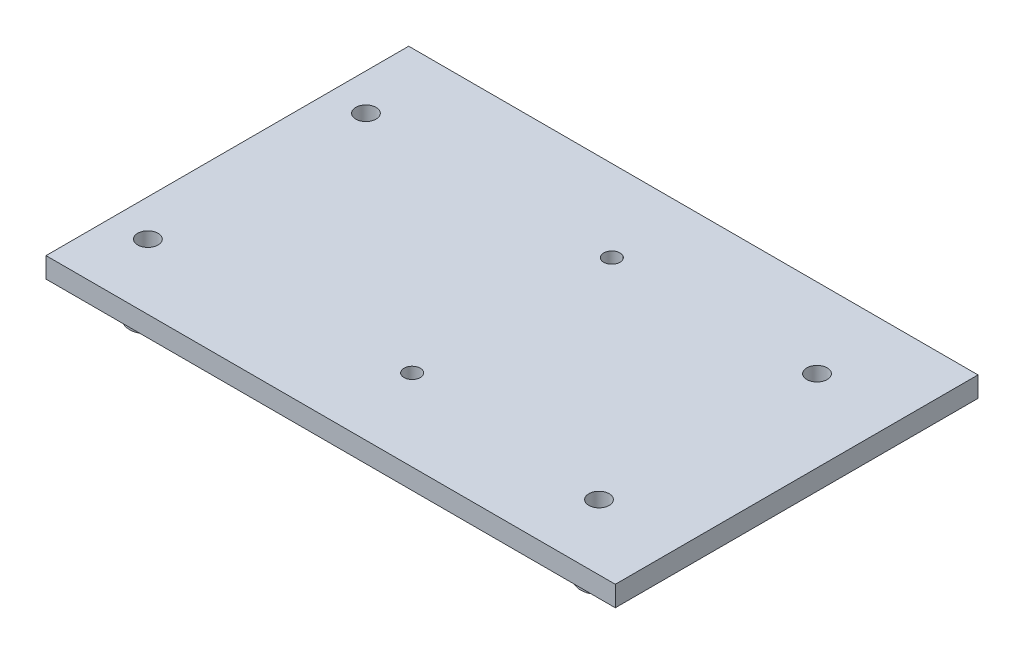
ISO-10303-21;
HEADER;
FILE_DESCRIPTION(('STEP AP214'),'2;1');
FILE_NAME('part.step','',(''),(''),'','','');
FILE_SCHEMA(('AUTOMOTIVE_DESIGN { 1 0 10303 214 1 1 1 1 }'));
ENDSEC;
DATA;
#1=APPLICATION_CONTEXT('core data for automotive mechanical design processes');
#2=APPLICATION_PROTOCOL_DEFINITION('international standard','automotive_design',2000,#1);
#3=PRODUCT_CONTEXT('',#1,'mechanical');
#4=PRODUCT('Part','Part','',(#3));
#5=PRODUCT_RELATED_PRODUCT_CATEGORY('part','',(#4));
#6=PRODUCT_DEFINITION_FORMATION('','',#4);
#7=PRODUCT_DEFINITION_CONTEXT('part definition',#1,'design');
#8=PRODUCT_DEFINITION('design','',#6,#7);
#9=PRODUCT_DEFINITION_SHAPE('','',#8);
#10=(LENGTH_UNIT() NAMED_UNIT(*) SI_UNIT(.MILLI.,.METRE.));
#11=(NAMED_UNIT(*) PLANE_ANGLE_UNIT() SI_UNIT($,.RADIAN.));
#12=(NAMED_UNIT(*) SI_UNIT($,.STERADIAN.) SOLID_ANGLE_UNIT());
#13=UNCERTAINTY_MEASURE_WITH_UNIT(LENGTH_MEASURE(1.E-05),#10,'distance_accuracy_value','');
#14=(GEOMETRIC_REPRESENTATION_CONTEXT(3) GLOBAL_UNCERTAINTY_ASSIGNED_CONTEXT((#13)) GLOBAL_UNIT_ASSIGNED_CONTEXT((#10,
#11,#12)) REPRESENTATION_CONTEXT('',''));
#15=CARTESIAN_POINT('',(0.,0.,0.));
#16=DIRECTION('',(0.,0.,1.));
#17=DIRECTION('',(1.,0.,0.));
#18=AXIS2_PLACEMENT_3D('',#15,#16,#17);
#19=CARTESIAN_POINT('',(-70.0318599395757,5.,44.1362801208486));
#20=DIRECTION('',(1.,0.,0.));
#21=DIRECTION('',(0.,0.,-1.));
#22=AXIS2_PLACEMENT_3D('',#19,#20,#21);
#23=PLANE('',#22);
#24=DIRECTION('',(0.,0.,1.));
#25=VECTOR('',#24,1.);
#26=CARTESIAN_POINT('',(-70.0318599395757,0.,44.1362801208486));
#27=LINE('',#26,#25);
#28=CARTESIAN_POINT('',(-70.0318599395757,0.,-44.8637198791513));
#29=VERTEX_POINT('',#28);
#30=CARTESIAN_POINT('',(-70.0318599395757,0.,44.1362801208486));
#31=VERTEX_POINT('',#30);
#32=EDGE_CURVE('E118',#29,#31,#27,.T.);
#33=ORIENTED_EDGE('',*,*,#32,.T.);
#34=DIRECTION('',(0.,-1.,0.));
#35=VECTOR('',#34,1.);
#36=CARTESIAN_POINT('',(-70.0318599395757,5.,44.1362801208486));
#37=LINE('',#36,#35);
#38=CARTESIAN_POINT('',(-70.0318599395757,5.,44.1362801208486));
#39=VERTEX_POINT('',#38);
#40=EDGE_CURVE('E11',#39,#31,#37,.T.);
#41=ORIENTED_EDGE('',*,*,#40,.F.);
#42=DIRECTION('',(0.,0.,1.));
#43=VECTOR('',#42,1.);
#44=CARTESIAN_POINT('',(-70.0318599395757,5.,44.1362801208486));
#45=LINE('',#44,#43);
#46=CARTESIAN_POINT('',(-70.0318599395757,5.,-44.8637198791513));
#47=VERTEX_POINT('',#46);
#48=EDGE_CURVE('E101',#47,#39,#45,.T.);
#49=ORIENTED_EDGE('',*,*,#48,.F.);
#50=DIRECTION('',(0.,-1.,0.));
#51=VECTOR('',#50,1.);
#52=CARTESIAN_POINT('',(-70.0318599395757,5.,-44.8637198791513));
#53=LINE('',#52,#51);
#54=EDGE_CURVE('E114',#47,#29,#53,.T.);
#55=ORIENTED_EDGE('',*,*,#54,.T.);
#56=EDGE_LOOP('',(#33,#41,#49,#55));
#57=FACE_BOUND('',#56,.T.);
#58=ADVANCED_FACE('F47',(#57),#23,.F.);
#59=CARTESIAN_POINT('',(-70.0318599395757,5.,44.1362801208486));
#60=DIRECTION('',(0.,0.,-1.));
#61=DIRECTION('',(-1.,0.,0.));
#62=AXIS2_PLACEMENT_3D('',#59,#60,#61);
#63=PLANE('',#62);
#64=DIRECTION('',(1.,0.,0.));
#65=VECTOR('',#64,1.);
#66=CARTESIAN_POINT('',(-70.0318599395757,0.,44.1362801208486));
#67=LINE('',#66,#65);
#68=CARTESIAN_POINT('',(69.6681400604243,0.,44.1362801208486));
#69=VERTEX_POINT('',#68);
#70=EDGE_CURVE('E106',#31,#69,#67,.T.);
#71=ORIENTED_EDGE('',*,*,#70,.T.);
#72=DIRECTION('',(0.,-1.,0.));
#73=VECTOR('',#72,1.);
#74=CARTESIAN_POINT('',(69.6681400604243,5.,44.1362801208486));
#75=LINE('',#74,#73);
#76=CARTESIAN_POINT('',(69.6681400604243,5.,44.1362801208486));
#77=VERTEX_POINT('',#76);
#78=EDGE_CURVE('E57',#77,#69,#75,.T.);
#79=ORIENTED_EDGE('',*,*,#78,.F.);
#80=DIRECTION('',(1.,0.,0.));
#81=VECTOR('',#80,1.);
#82=CARTESIAN_POINT('',(-70.0318599395757,5.,44.1362801208486));
#83=LINE('',#82,#81);
#84=EDGE_CURVE('E96',#39,#77,#83,.T.);
#85=ORIENTED_EDGE('',*,*,#84,.F.);
#86=ORIENTED_EDGE('',*,*,#40,.T.);
#87=EDGE_LOOP('',(#71,#79,#85,#86));
#88=FACE_BOUND('',#87,.T.);
#89=ADVANCED_FACE('F105',(#88),#63,.F.);
#90=CARTESIAN_POINT('',(69.6681400604243,5.,44.1362801208486));
#91=DIRECTION('',(-1.,0.,0.));
#92=DIRECTION('',(0.,0.,1.));
#93=AXIS2_PLACEMENT_3D('',#90,#91,#92);
#94=PLANE('',#93);
#95=DIRECTION('',(0.,0.,-1.));
#96=VECTOR('',#95,1.);
#97=CARTESIAN_POINT('',(69.6681400604243,0.,44.1362801208486));
#98=LINE('',#97,#96);
#99=CARTESIAN_POINT('',(69.6681400604243,0.,-44.8637198791513));
#100=VERTEX_POINT('',#99);
#101=EDGE_CURVE('E83',#69,#100,#98,.T.);
#102=ORIENTED_EDGE('',*,*,#101,.T.);
#103=DIRECTION('',(0.,-1.,0.));
#104=VECTOR('',#103,1.);
#105=CARTESIAN_POINT('',(69.6681400604243,5.,-44.8637198791513));
#106=LINE('',#105,#104);
#107=CARTESIAN_POINT('',(69.6681400604243,5.,-44.8637198791513));
#108=VERTEX_POINT('',#107);
#109=EDGE_CURVE('E108',#108,#100,#106,.T.);
#110=ORIENTED_EDGE('',*,*,#109,.F.);
#111=DIRECTION('',(0.,0.,-1.));
#112=VECTOR('',#111,1.);
#113=CARTESIAN_POINT('',(69.6681400604243,5.,44.1362801208486));
#114=LINE('',#113,#112);
#115=EDGE_CURVE('E99',#77,#108,#114,.T.);
#116=ORIENTED_EDGE('',*,*,#115,.F.);
#117=ORIENTED_EDGE('',*,*,#78,.T.);
#118=EDGE_LOOP('',(#102,#110,#116,#117));
#119=FACE_BOUND('',#118,.T.);
#120=ADVANCED_FACE('F110',(#119),#94,.F.);
#121=CARTESIAN_POINT('',(-70.0318599395757,5.,-44.8637198791513));
#122=DIRECTION('',(0.,0.,1.));
#123=DIRECTION('',(1.,0.,0.));
#124=AXIS2_PLACEMENT_3D('',#121,#122,#123);
#125=PLANE('',#124);
#126=DIRECTION('',(-1.,0.,0.));
#127=VECTOR('',#126,1.);
#128=CARTESIAN_POINT('',(-70.0318599395757,0.,-44.8637198791513));
#129=LINE('',#128,#127);
#130=EDGE_CURVE('E89',#100,#29,#129,.T.);
#131=ORIENTED_EDGE('',*,*,#130,.T.);
#132=ORIENTED_EDGE('',*,*,#54,.F.);
#133=DIRECTION('',(-1.,0.,0.));
#134=VECTOR('',#133,1.);
#135=CARTESIAN_POINT('',(-70.0318599395757,5.,-44.8637198791513));
#136=LINE('',#135,#134);
#137=EDGE_CURVE('E66',#108,#47,#136,.T.);
#138=ORIENTED_EDGE('',*,*,#137,.F.);
#139=ORIENTED_EDGE('',*,*,#109,.T.);
#140=EDGE_LOOP('',(#131,#132,#138,#139));
#141=FACE_BOUND('',#140,.T.);
#142=ADVANCED_FACE('F236',(#141),#125,.F.);
#143=CARTESIAN_POINT('',(0.,5.,0.));
#144=DIRECTION('',(0.,-1.,0.));
#145=DIRECTION('',(0.,0.,-1.));
#146=AXIS2_PLACEMENT_3D('',#143,#144,#145);
#147=PLANE('',#146);
#148=CARTESIAN_POINT('',(49.6681400604243,5.,28.1362801208486));
#149=DIRECTION('',(0.,-1.,0.));
#150=DIRECTION('',(0.,0.,-1.));
#151=AXIS2_PLACEMENT_3D('',#148,#149,#150);
#152=CIRCLE('',#151,2.5);
#153=CARTESIAN_POINT('',(49.6681400604243,5.,25.6362801208486));
#154=VERTEX_POINT('',#153);
#155=EDGE_CURVE('E50',#154,#154,#152,.T.);
#156=ORIENTED_EDGE('',*,*,#155,.T.);
#157=EDGE_LOOP('',(#156));
#158=FACE_BOUND('',#157,.T.);
#159=CARTESIAN_POINT('',(49.6681400604243,5.,-25.3637198791514));
#160=DIRECTION('',(0.,-1.,0.));
#161=DIRECTION('',(0.,0.,-1.));
#162=AXIS2_PLACEMENT_3D('',#159,#160,#161);
#163=CIRCLE('',#162,2.5);
#164=CARTESIAN_POINT('',(49.6681400604243,5.,-27.8637198791514));
#165=VERTEX_POINT('',#164);
#166=EDGE_CURVE('E140',#165,#165,#163,.T.);
#167=ORIENTED_EDGE('',*,*,#166,.T.);
#168=EDGE_LOOP('',(#167));
#169=FACE_BOUND('',#168,.T.);
#170=CARTESIAN_POINT('',(-61.0318599395757,5.,-25.3637198791513));
#171=DIRECTION('',(0.,-1.,0.));
#172=DIRECTION('',(0.,0.,-1.));
#173=AXIS2_PLACEMENT_3D('',#170,#171,#172);
#174=CIRCLE('',#173,2.5);
#175=CARTESIAN_POINT('',(-61.0318599395757,5.,-27.8637198791513));
#176=VERTEX_POINT('',#175);
#177=EDGE_CURVE('E137',#176,#176,#174,.T.);
#178=ORIENTED_EDGE('',*,*,#177,.T.);
#179=EDGE_LOOP('',(#178));
#180=FACE_BOUND('',#179,.T.);
#181=CARTESIAN_POINT('',(-61.0318599395757,5.,28.1362801208486));
#182=DIRECTION('',(0.,-1.,0.));
#183=DIRECTION('',(0.,0.,-1.));
#184=AXIS2_PLACEMENT_3D('',#181,#182,#183);
#185=CIRCLE('',#184,2.5);
#186=CARTESIAN_POINT('',(-61.0318599395757,5.,25.6362801208486));
#187=VERTEX_POINT('',#186);
#188=EDGE_CURVE('E133',#187,#187,#185,.T.);
#189=ORIENTED_EDGE('',*,*,#188,.T.);
#190=EDGE_LOOP('',(#189));
#191=FACE_BOUND('',#190,.T.);
#192=CARTESIAN_POINT('',(-0.181859939575701,5.,24.1362801208486));
#193=DIRECTION('',(0.,-1.,0.));
#194=DIRECTION('',(0.,0.,-1.));
#195=AXIS2_PLACEMENT_3D('',#192,#193,#194);
#196=CIRCLE('',#195,2.);
#197=CARTESIAN_POINT('',(-0.181859939575701,5.,22.1362801208486));
#198=VERTEX_POINT('',#197);
#199=EDGE_CURVE('E171',#198,#198,#196,.T.);
#200=ORIENTED_EDGE('',*,*,#199,.T.);
#201=EDGE_LOOP('',(#200));
#202=FACE_BOUND('',#201,.T.);
#203=CARTESIAN_POINT('',(-0.181859939575701,5.,-24.8637198791513));
#204=DIRECTION('',(0.,-1.,0.));
#205=DIRECTION('',(0.,0.,-1.));
#206=AXIS2_PLACEMENT_3D('',#203,#204,#205);
#207=CIRCLE('',#206,2.);
#208=CARTESIAN_POINT('',(-0.181859939575701,5.,-26.8637198791513));
#209=VERTEX_POINT('',#208);
#210=EDGE_CURVE('E147',#209,#209,#207,.T.);
#211=ORIENTED_EDGE('',*,*,#210,.T.);
#212=EDGE_LOOP('',(#211));
#213=FACE_BOUND('',#212,.T.);
#214=ORIENTED_EDGE('',*,*,#48,.T.);
#215=ORIENTED_EDGE('',*,*,#84,.T.);
#216=ORIENTED_EDGE('',*,*,#115,.T.);
#217=ORIENTED_EDGE('',*,*,#137,.T.);
#218=EDGE_LOOP('',(#214,#215,#216,#217));
#219=FACE_BOUND('',#218,.T.);
#220=ADVANCED_FACE('F97',(#158,#169,#180,#191,#202,#213,#219),#147,.F.);
#221=CARTESIAN_POINT('',(0.,0.,0.));
#222=DIRECTION('',(0.,-1.,0.));
#223=DIRECTION('',(0.,0.,-1.));
#224=AXIS2_PLACEMENT_3D('',#221,#222,#223);
#225=PLANE('',#224);
#226=CARTESIAN_POINT('',(-0.181859939575701,0.,24.1362801208486));
#227=DIRECTION('',(0.,-1.,0.));
#228=DIRECTION('',(0.,0.,-1.));
#229=AXIS2_PLACEMENT_3D('',#226,#227,#228);
#230=CIRCLE('',#229,2.);
#231=CARTESIAN_POINT('',(-0.181859939575701,0.,22.1362801208486));
#232=VERTEX_POINT('',#231);
#233=EDGE_CURVE('E158',#232,#232,#230,.T.);
#234=ORIENTED_EDGE('',*,*,#233,.F.);
#235=EDGE_LOOP('',(#234));
#236=FACE_BOUND('',#235,.T.);
#237=CARTESIAN_POINT('',(-0.181859939575701,0.,-24.8637198791513));
#238=DIRECTION('',(0.,-1.,0.));
#239=DIRECTION('',(0.,0.,-1.));
#240=AXIS2_PLACEMENT_3D('',#237,#238,#239);
#241=CIRCLE('',#240,2.);
#242=CARTESIAN_POINT('',(-0.181859939575701,0.,-26.8637198791513));
#243=VERTEX_POINT('',#242);
#244=EDGE_CURVE('E152',#243,#243,#241,.T.);
#245=ORIENTED_EDGE('',*,*,#244,.F.);
#246=EDGE_LOOP('',(#245));
#247=FACE_BOUND('',#246,.T.);
#248=CARTESIAN_POINT('',(49.6681400604243,0.,-25.3637198791514));
#249=DIRECTION('',(0.,-1.,0.));
#250=DIRECTION('',(0.,0.,-1.));
#251=AXIS2_PLACEMENT_3D('',#248,#249,#250);
#252=CIRCLE('',#251,4.5);
#253=CARTESIAN_POINT('',(49.6681400604243,0.,-29.8637198791513));
#254=VERTEX_POINT('',#253);
#255=EDGE_CURVE('E162',#254,#254,#252,.T.);
#256=ORIENTED_EDGE('',*,*,#255,.F.);
#257=EDGE_LOOP('',(#256));
#258=FACE_BOUND('',#257,.T.);
#259=CARTESIAN_POINT('',(-61.0318599395757,0.,-25.3637198791513));
#260=DIRECTION('',(0.,-1.,0.));
#261=DIRECTION('',(0.,0.,-1.));
#262=AXIS2_PLACEMENT_3D('',#259,#260,#261);
#263=CIRCLE('',#262,4.5);
#264=CARTESIAN_POINT('',(-61.0318599395757,0.,-29.8637198791513));
#265=VERTEX_POINT('',#264);
#266=EDGE_CURVE('E176',#265,#265,#263,.T.);
#267=ORIENTED_EDGE('',*,*,#266,.F.);
#268=EDGE_LOOP('',(#267));
#269=FACE_BOUND('',#268,.T.);
#270=CARTESIAN_POINT('',(49.6681400604243,0.,28.1362801208486));
#271=DIRECTION('',(0.,-1.,0.));
#272=DIRECTION('',(0.,0.,-1.));
#273=AXIS2_PLACEMENT_3D('',#270,#271,#272);
#274=CIRCLE('',#273,4.5);
#275=CARTESIAN_POINT('',(49.6681400604243,0.,23.6362801208486));
#276=VERTEX_POINT('',#275);
#277=EDGE_CURVE('E188',#276,#276,#274,.T.);
#278=ORIENTED_EDGE('',*,*,#277,.F.);
#279=EDGE_LOOP('',(#278));
#280=FACE_BOUND('',#279,.T.);
#281=CARTESIAN_POINT('',(-61.0318599395757,0.,28.1362801208486));
#282=DIRECTION('',(0.,-1.,0.));
#283=DIRECTION('',(0.,0.,-1.));
#284=AXIS2_PLACEMENT_3D('',#281,#282,#283);
#285=CIRCLE('',#284,4.5);
#286=CARTESIAN_POINT('',(-61.0318599395757,0.,23.6362801208486));
#287=VERTEX_POINT('',#286);
#288=EDGE_CURVE('E203',#287,#287,#285,.T.);
#289=ORIENTED_EDGE('',*,*,#288,.F.);
#290=EDGE_LOOP('',(#289));
#291=FACE_BOUND('',#290,.T.);
#292=ORIENTED_EDGE('',*,*,#32,.F.);
#293=ORIENTED_EDGE('',*,*,#130,.F.);
#294=ORIENTED_EDGE('',*,*,#101,.F.);
#295=ORIENTED_EDGE('',*,*,#70,.F.);
#296=EDGE_LOOP('',(#292,#293,#294,#295));
#297=FACE_BOUND('',#296,.T.);
#298=ADVANCED_FACE('F219',(#236,#247,#258,#269,#280,#291,#297),#225,.T.);
#299=CARTESIAN_POINT('',(-61.0318599395757,-12.,28.1362801208486));
#300=DIRECTION('',(0.,-1.,0.));
#301=DIRECTION('',(0.,0.,-1.));
#302=AXIS2_PLACEMENT_3D('',#299,#300,#301);
#303=PLANE('',#302);
#304=CARTESIAN_POINT('',(-61.0318599395757,-12.,28.1362801208486));
#305=DIRECTION('',(0.,-1.,0.));
#306=DIRECTION('',(0.,0.,-1.));
#307=AXIS2_PLACEMENT_3D('',#304,#305,#306);
#308=CIRCLE('',#307,4.5);
#309=CARTESIAN_POINT('',(-61.0318599395757,-12.,23.6362801208486));
#310=VERTEX_POINT('',#309);
#311=EDGE_CURVE('E122',#310,#310,#308,.T.);
#312=ORIENTED_EDGE('',*,*,#311,.T.);
#313=EDGE_LOOP('',(#312));
#314=FACE_BOUND('',#313,.T.);
#315=CARTESIAN_POINT('',(-61.0318599395757,-12.,28.1362801208486));
#316=DIRECTION('',(0.,-1.,0.));
#317=DIRECTION('',(0.,0.,-1.));
#318=AXIS2_PLACEMENT_3D('',#315,#316,#317);
#319=CIRCLE('',#318,2.5);
#320=CARTESIAN_POINT('',(-61.0318599395757,-12.,25.6362801208486));
#321=VERTEX_POINT('',#320);
#322=EDGE_CURVE('E199',#321,#321,#319,.T.);
#323=ORIENTED_EDGE('',*,*,#322,.F.);
#324=EDGE_LOOP('',(#323));
#325=FACE_BOUND('',#324,.T.);
#326=ADVANCED_FACE('F222',(#314,#325),#303,.T.);
#327=CARTESIAN_POINT('',(-61.0318599395757,-12.,28.1362801208486));
#328=DIRECTION('',(0.,1.,0.));
#329=DIRECTION('',(0.,0.,1.));
#330=AXIS2_PLACEMENT_3D('',#327,#328,#329);
#331=CYLINDRICAL_SURFACE('',#330,4.5);
#332=ORIENTED_EDGE('',*,*,#311,.F.);
#333=EDGE_LOOP('',(#332));
#334=FACE_BOUND('',#333,.T.);
#335=ORIENTED_EDGE('',*,*,#288,.T.);
#336=EDGE_LOOP('',(#335));
#337=FACE_BOUND('',#336,.T.);
#338=ADVANCED_FACE('F286',(#334,#337),#331,.T.);
#339=CARTESIAN_POINT('',(-61.0318599395757,-12.,28.1362801208486));
#340=DIRECTION('',(0.,1.,0.));
#341=DIRECTION('',(0.,0.,1.));
#342=AXIS2_PLACEMENT_3D('',#339,#340,#341);
#343=CYLINDRICAL_SURFACE('',#342,2.5);
#344=ORIENTED_EDGE('',*,*,#322,.T.);
#345=EDGE_LOOP('',(#344));
#346=FACE_BOUND('',#345,.T.);
#347=ORIENTED_EDGE('',*,*,#188,.F.);
#348=EDGE_LOOP('',(#347));
#349=FACE_BOUND('',#348,.T.);
#350=ADVANCED_FACE('F296',(#346,#349),#343,.F.);
#351=CARTESIAN_POINT('',(49.6681400604243,-12.,28.1362801208486));
#352=DIRECTION('',(0.,-1.,0.));
#353=DIRECTION('',(0.,0.,-1.));
#354=AXIS2_PLACEMENT_3D('',#351,#352,#353);
#355=PLANE('',#354);
#356=CARTESIAN_POINT('',(49.6681400604243,-12.,28.1362801208486));
#357=DIRECTION('',(0.,-1.,0.));
#358=DIRECTION('',(0.,0.,-1.));
#359=AXIS2_PLACEMENT_3D('',#356,#357,#358);
#360=CIRCLE('',#359,4.5);
#361=CARTESIAN_POINT('',(49.6681400604243,-12.,23.6362801208486));
#362=VERTEX_POINT('',#361);
#363=EDGE_CURVE('E187',#362,#362,#360,.T.);
#364=ORIENTED_EDGE('',*,*,#363,.T.);
#365=EDGE_LOOP('',(#364));
#366=FACE_BOUND('',#365,.T.);
#367=CARTESIAN_POINT('',(49.6681400604243,-12.,28.1362801208486));
#368=DIRECTION('',(0.,-1.,0.));
#369=DIRECTION('',(0.,0.,-1.));
#370=AXIS2_PLACEMENT_3D('',#367,#368,#369);
#371=CIRCLE('',#370,2.5);
#372=CARTESIAN_POINT('',(49.6681400604243,-12.,25.6362801208486));
#373=VERTEX_POINT('',#372);
#374=EDGE_CURVE('E192',#373,#373,#371,.T.);
#375=ORIENTED_EDGE('',*,*,#374,.F.);
#376=EDGE_LOOP('',(#375));
#377=FACE_BOUND('',#376,.T.);
#378=ADVANCED_FACE('F307',(#366,#377),#355,.T.);
#379=CARTESIAN_POINT('',(49.6681400604243,-12.,28.1362801208486));
#380=DIRECTION('',(0.,1.,0.));
#381=DIRECTION('',(0.,0.,1.));
#382=AXIS2_PLACEMENT_3D('',#379,#380,#381);
#383=CYLINDRICAL_SURFACE('',#382,4.5);
#384=ORIENTED_EDGE('',*,*,#363,.F.);
#385=EDGE_LOOP('',(#384));
#386=FACE_BOUND('',#385,.T.);
#387=ORIENTED_EDGE('',*,*,#277,.T.);
#388=EDGE_LOOP('',(#387));
#389=FACE_BOUND('',#388,.T.);
#390=ADVANCED_FACE('F319',(#386,#389),#383,.T.);
#391=CARTESIAN_POINT('',(49.6681400604243,-12.,28.1362801208486));
#392=DIRECTION('',(0.,1.,0.));
#393=DIRECTION('',(0.,0.,1.));
#394=AXIS2_PLACEMENT_3D('',#391,#392,#393);
#395=CYLINDRICAL_SURFACE('',#394,2.5);
#396=ORIENTED_EDGE('',*,*,#374,.T.);
#397=EDGE_LOOP('',(#396));
#398=FACE_BOUND('',#397,.T.);
#399=ORIENTED_EDGE('',*,*,#155,.F.);
#400=EDGE_LOOP('',(#399));
#401=FACE_BOUND('',#400,.T.);
#402=ADVANCED_FACE('F329',(#398,#401),#395,.F.);
#403=CARTESIAN_POINT('',(-61.0318599395757,-12.,-25.3637198791513));
#404=DIRECTION('',(0.,-1.,0.));
#405=DIRECTION('',(0.,0.,-1.));
#406=AXIS2_PLACEMENT_3D('',#403,#404,#405);
#407=PLANE('',#406);
#408=CARTESIAN_POINT('',(-61.0318599395757,-12.,-25.3637198791513));
#409=DIRECTION('',(0.,-1.,0.));
#410=DIRECTION('',(0.,0.,-1.));
#411=AXIS2_PLACEMENT_3D('',#408,#409,#410);
#412=CIRCLE('',#411,4.5);
#413=CARTESIAN_POINT('',(-61.0318599395757,-12.,-29.8637198791513));
#414=VERTEX_POINT('',#413);
#415=EDGE_CURVE('E175',#414,#414,#412,.T.);
#416=ORIENTED_EDGE('',*,*,#415,.T.);
#417=EDGE_LOOP('',(#416));
#418=FACE_BOUND('',#417,.T.);
#419=CARTESIAN_POINT('',(-61.0318599395757,-12.,-25.3637198791513));
#420=DIRECTION('',(0.,-1.,0.));
#421=DIRECTION('',(0.,0.,-1.));
#422=AXIS2_PLACEMENT_3D('',#419,#420,#421);
#423=CIRCLE('',#422,2.5);
#424=CARTESIAN_POINT('',(-61.0318599395757,-12.,-27.8637198791513));
#425=VERTEX_POINT('',#424);
#426=EDGE_CURVE('E180',#425,#425,#423,.T.);
#427=ORIENTED_EDGE('',*,*,#426,.F.);
#428=EDGE_LOOP('',(#427));
#429=FACE_BOUND('',#428,.T.);
#430=ADVANCED_FACE('F340',(#418,#429),#407,.T.);
#431=CARTESIAN_POINT('',(-61.0318599395757,-12.,-25.3637198791513));
#432=DIRECTION('',(0.,1.,0.));
#433=DIRECTION('',(0.,0.,1.));
#434=AXIS2_PLACEMENT_3D('',#431,#432,#433);
#435=CYLINDRICAL_SURFACE('',#434,4.5);
#436=ORIENTED_EDGE('',*,*,#415,.F.);
#437=EDGE_LOOP('',(#436));
#438=FACE_BOUND('',#437,.T.);
#439=ORIENTED_EDGE('',*,*,#266,.T.);
#440=EDGE_LOOP('',(#439));
#441=FACE_BOUND('',#440,.T.);
#442=ADVANCED_FACE('F351',(#438,#441),#435,.T.);
#443=CARTESIAN_POINT('',(-61.0318599395757,-12.,-25.3637198791513));
#444=DIRECTION('',(0.,1.,0.));
#445=DIRECTION('',(0.,0.,1.));
#446=AXIS2_PLACEMENT_3D('',#443,#444,#445);
#447=CYLINDRICAL_SURFACE('',#446,2.5);
#448=ORIENTED_EDGE('',*,*,#426,.T.);
#449=EDGE_LOOP('',(#448));
#450=FACE_BOUND('',#449,.T.);
#451=ORIENTED_EDGE('',*,*,#177,.F.);
#452=EDGE_LOOP('',(#451));
#453=FACE_BOUND('',#452,.T.);
#454=ADVANCED_FACE('F361',(#450,#453),#447,.F.);
#455=CARTESIAN_POINT('',(49.6681400604243,-12.,-25.3637198791514));
#456=DIRECTION('',(0.,-1.,0.));
#457=DIRECTION('',(0.,0.,-1.));
#458=AXIS2_PLACEMENT_3D('',#455,#456,#457);
#459=PLANE('',#458);
#460=CARTESIAN_POINT('',(49.6681400604243,-12.,-25.3637198791514));
#461=DIRECTION('',(0.,-1.,0.));
#462=DIRECTION('',(0.,0.,-1.));
#463=AXIS2_PLACEMENT_3D('',#460,#461,#462);
#464=CIRCLE('',#463,4.5);
#465=CARTESIAN_POINT('',(49.6681400604243,-12.,-29.8637198791513));
#466=VERTEX_POINT('',#465);
#467=EDGE_CURVE('E167',#466,#466,#464,.T.);
#468=ORIENTED_EDGE('',*,*,#467,.T.);
#469=EDGE_LOOP('',(#468));
#470=FACE_BOUND('',#469,.T.);
#471=CARTESIAN_POINT('',(49.6681400604243,-12.,-25.3637198791514));
#472=DIRECTION('',(0.,-1.,0.));
#473=DIRECTION('',(0.,0.,-1.));
#474=AXIS2_PLACEMENT_3D('',#471,#472,#473);
#475=CIRCLE('',#474,2.5);
#476=CARTESIAN_POINT('',(49.6681400604243,-12.,-27.8637198791514));
#477=VERTEX_POINT('',#476);
#478=EDGE_CURVE('E166',#477,#477,#475,.T.);
#479=ORIENTED_EDGE('',*,*,#478,.F.);
#480=EDGE_LOOP('',(#479));
#481=FACE_BOUND('',#480,.T.);
#482=ADVANCED_FACE('F372',(#470,#481),#459,.T.);
#483=CARTESIAN_POINT('',(49.6681400604243,-12.,-25.3637198791514));
#484=DIRECTION('',(0.,1.,0.));
#485=DIRECTION('',(0.,0.,1.));
#486=AXIS2_PLACEMENT_3D('',#483,#484,#485);
#487=CYLINDRICAL_SURFACE('',#486,4.5);
#488=ORIENTED_EDGE('',*,*,#467,.F.);
#489=EDGE_LOOP('',(#488));
#490=FACE_BOUND('',#489,.T.);
#491=ORIENTED_EDGE('',*,*,#255,.T.);
#492=EDGE_LOOP('',(#491));
#493=FACE_BOUND('',#492,.T.);
#494=ADVANCED_FACE('F383',(#490,#493),#487,.T.);
#495=CARTESIAN_POINT('',(49.6681400604243,-12.,-25.3637198791514));
#496=DIRECTION('',(0.,1.,0.));
#497=DIRECTION('',(0.,0.,1.));
#498=AXIS2_PLACEMENT_3D('',#495,#496,#497);
#499=CYLINDRICAL_SURFACE('',#498,2.5);
#500=ORIENTED_EDGE('',*,*,#478,.T.);
#501=EDGE_LOOP('',(#500));
#502=FACE_BOUND('',#501,.T.);
#503=ORIENTED_EDGE('',*,*,#166,.F.);
#504=EDGE_LOOP('',(#503));
#505=FACE_BOUND('',#504,.T.);
#506=ADVANCED_FACE('F392',(#502,#505),#499,.F.);
#507=CARTESIAN_POINT('',(-0.181859939575701,5.,-24.8637198791513));
#508=DIRECTION('',(0.,-1.,0.));
#509=DIRECTION('',(0.,0.,-1.));
#510=AXIS2_PLACEMENT_3D('',#507,#508,#509);
#511=CYLINDRICAL_SURFACE('',#510,2.);
#512=ORIENTED_EDGE('',*,*,#210,.F.);
#513=EDGE_LOOP('',(#512));
#514=FACE_BOUND('',#513,.T.);
#515=ORIENTED_EDGE('',*,*,#244,.T.);
#516=EDGE_LOOP('',(#515));
#517=FACE_BOUND('',#516,.T.);
#518=ADVANCED_FACE('F402',(#514,#517),#511,.F.);
#519=CARTESIAN_POINT('',(-0.181859939575701,5.,24.1362801208486));
#520=DIRECTION('',(0.,-1.,0.));
#521=DIRECTION('',(0.,0.,-1.));
#522=AXIS2_PLACEMENT_3D('',#519,#520,#521);
#523=CYLINDRICAL_SURFACE('',#522,2.);
#524=ORIENTED_EDGE('',*,*,#199,.F.);
#525=EDGE_LOOP('',(#524));
#526=FACE_BOUND('',#525,.T.);
#527=ORIENTED_EDGE('',*,*,#233,.T.);
#528=EDGE_LOOP('',(#527));
#529=FACE_BOUND('',#528,.T.);
#530=ADVANCED_FACE('F217',(#526,#529),#523,.F.);
#531=CLOSED_SHELL('',(#58,#89,#120,#142,#220,#298,#326,#338,#350,#378,#390,#402,#430,#442,#454,
#482,#494,#506,#518,#530));
#532=MANIFOLD_SOLID_BREP('B2',#531);
#533=ADVANCED_BREP_SHAPE_REPRESENTATION('',(#18,#532),#14);
#534=SHAPE_DEFINITION_REPRESENTATION(#9,#533);
ENDSEC;
END-ISO-10303-21;
